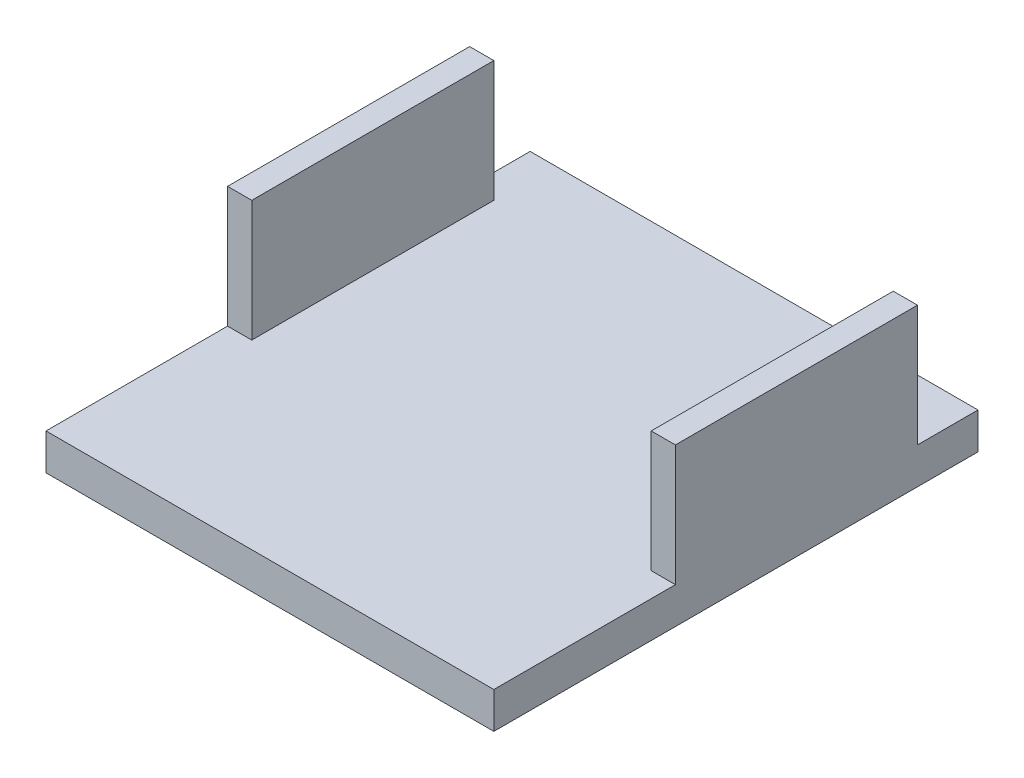
ISO-10303-21;
HEADER;
FILE_DESCRIPTION(('STEP AP214'),'2;1');
FILE_NAME('part.step','',(''),(''),'','','');
FILE_SCHEMA(('AUTOMOTIVE_DESIGN { 1 0 10303 214 1 1 1 1 }'));
ENDSEC;
DATA;
#1=APPLICATION_CONTEXT('core data for automotive mechanical design processes');
#2=APPLICATION_PROTOCOL_DEFINITION('international standard','automotive_design',2000,#1);
#3=PRODUCT_CONTEXT('',#1,'mechanical');
#4=PRODUCT('Part','Part','',(#3));
#5=PRODUCT_RELATED_PRODUCT_CATEGORY('part','',(#4));
#6=PRODUCT_DEFINITION_FORMATION('','',#4);
#7=PRODUCT_DEFINITION_CONTEXT('part definition',#1,'design');
#8=PRODUCT_DEFINITION('design','',#6,#7);
#9=PRODUCT_DEFINITION_SHAPE('','',#8);
#10=(LENGTH_UNIT() NAMED_UNIT(*) SI_UNIT(.MILLI.,.METRE.));
#11=(NAMED_UNIT(*) PLANE_ANGLE_UNIT() SI_UNIT($,.RADIAN.));
#12=(NAMED_UNIT(*) SI_UNIT($,.STERADIAN.) SOLID_ANGLE_UNIT());
#13=UNCERTAINTY_MEASURE_WITH_UNIT(LENGTH_MEASURE(1.E-05),#10,'distance_accuracy_value','');
#14=(GEOMETRIC_REPRESENTATION_CONTEXT(3) GLOBAL_UNCERTAINTY_ASSIGNED_CONTEXT((#13)) GLOBAL_UNIT_ASSIGNED_CONTEXT((#10,
#11,#12)) REPRESENTATION_CONTEXT('',''));
#15=CARTESIAN_POINT('',(0.,0.,0.));
#16=DIRECTION('',(0.,0.,1.));
#17=DIRECTION('',(1.,0.,0.));
#18=AXIS2_PLACEMENT_3D('',#15,#16,#17);
#19=CARTESIAN_POINT('',(0.,3.,0.));
#20=DIRECTION('',(0.,-1.,0.));
#21=DIRECTION('',(0.,0.,-1.));
#22=AXIS2_PLACEMENT_3D('',#19,#20,#21);
#23=PLANE('',#22);
#24=DIRECTION('',(1.,0.,0.));
#25=VECTOR('',#24,1.);
#26=CARTESIAN_POINT('',(0.,3.,-15.));
#27=LINE('',#26,#25);
#28=CARTESIAN_POINT('',(0.,3.,-15.));
#29=VERTEX_POINT('',#28);
#30=CARTESIAN_POINT('',(2.,3.,-15.));
#31=VERTEX_POINT('',#30);
#32=EDGE_CURVE('E227',#29,#31,#27,.T.);
#33=ORIENTED_EDGE('',*,*,#32,.F.);
#34=DIRECTION('',(0.,0.,1.));
#35=VECTOR('',#34,1.);
#36=CARTESIAN_POINT('',(0.,3.,0.));
#37=LINE('',#36,#35);
#38=CARTESIAN_POINT('',(0.,3.,0.));
#39=VERTEX_POINT('',#38);
#40=EDGE_CURVE('E145',#29,#39,#37,.T.);
#41=ORIENTED_EDGE('',*,*,#40,.T.);
#42=DIRECTION('',(1.,0.,0.));
#43=VECTOR('',#42,1.);
#44=CARTESIAN_POINT('',(0.,3.,0.));
#45=LINE('',#44,#43);
#46=CARTESIAN_POINT('',(37.,3.,0.));
#47=VERTEX_POINT('',#46);
#48=EDGE_CURVE('E184',#39,#47,#45,.T.);
#49=ORIENTED_EDGE('',*,*,#48,.T.);
#50=DIRECTION('',(0.,0.,-1.));
#51=VECTOR('',#50,1.);
#52=CARTESIAN_POINT('',(37.,3.,0.));
#53=LINE('',#52,#51);
#54=CARTESIAN_POINT('',(37.,3.,-15.));
#55=VERTEX_POINT('',#54);
#56=EDGE_CURVE('E187',#47,#55,#53,.T.);
#57=ORIENTED_EDGE('',*,*,#56,.T.);
#58=DIRECTION('',(1.,0.,0.));
#59=VECTOR('',#58,1.);
#60=CARTESIAN_POINT('',(37.,3.,-15.));
#61=LINE('',#60,#59);
#62=CARTESIAN_POINT('',(35.,3.,-15.));
#63=VERTEX_POINT('',#62);
#64=EDGE_CURVE('E159',#63,#55,#61,.T.);
#65=ORIENTED_EDGE('',*,*,#64,.F.);
#66=DIRECTION('',(0.,0.,1.));
#67=VECTOR('',#66,1.);
#68=CARTESIAN_POINT('',(35.,3.,-35.));
#69=LINE('',#68,#67);
#70=CARTESIAN_POINT('',(35.,3.,-35.));
#71=VERTEX_POINT('',#70);
#72=EDGE_CURVE('E149',#71,#63,#69,.T.);
#73=ORIENTED_EDGE('',*,*,#72,.F.);
#74=DIRECTION('',(-1.,0.,0.));
#75=VECTOR('',#74,1.);
#76=CARTESIAN_POINT('',(37.,3.,-35.));
#77=LINE('',#76,#75);
#78=CARTESIAN_POINT('',(37.,3.,-35.));
#79=VERTEX_POINT('',#78);
#80=EDGE_CURVE('E146',#79,#71,#77,.T.);
#81=ORIENTED_EDGE('',*,*,#80,.F.);
#82=CARTESIAN_POINT('',(37.,3.,-40.));
#83=VERTEX_POINT('',#82);
#84=EDGE_CURVE('E186',#79,#83,#53,.T.);
#85=ORIENTED_EDGE('',*,*,#84,.T.);
#86=DIRECTION('',(-1.,0.,0.));
#87=VECTOR('',#86,1.);
#88=CARTESIAN_POINT('',(0.,3.,-40.));
#89=LINE('',#88,#87);
#90=CARTESIAN_POINT('',(0.,3.,-40.));
#91=VERTEX_POINT('',#90);
#92=EDGE_CURVE('E189',#83,#91,#89,.T.);
#93=ORIENTED_EDGE('',*,*,#92,.T.);
#94=CARTESIAN_POINT('',(0.,3.,-35.));
#95=VERTEX_POINT('',#94);
#96=EDGE_CURVE('E182',#91,#95,#37,.T.);
#97=ORIENTED_EDGE('',*,*,#96,.T.);
#98=DIRECTION('',(-1.,0.,0.));
#99=VECTOR('',#98,1.);
#100=CARTESIAN_POINT('',(0.,3.,-35.));
#101=LINE('',#100,#99);
#102=CARTESIAN_POINT('',(2.,3.,-35.));
#103=VERTEX_POINT('',#102);
#104=EDGE_CURVE('E55',#103,#95,#101,.T.);
#105=ORIENTED_EDGE('',*,*,#104,.F.);
#106=DIRECTION('',(0.,0.,-1.));
#107=VECTOR('',#106,1.);
#108=CARTESIAN_POINT('',(2.,3.,-35.));
#109=LINE('',#108,#107);
#110=EDGE_CURVE('E50',#31,#103,#109,.T.);
#111=ORIENTED_EDGE('',*,*,#110,.F.);
#112=EDGE_LOOP('',(#33,#41,#49,#57,#65,#73,#81,#85,#93,#97,#105,#111));
#113=FACE_BOUND('',#112,.T.);
#114=ADVANCED_FACE('F35',(#113),#23,.F.);
#115=CARTESIAN_POINT('',(0.,3.,0.));
#116=DIRECTION('',(1.,0.,0.));
#117=DIRECTION('',(0.,0.,-1.));
#118=AXIS2_PLACEMENT_3D('',#115,#116,#117);
#119=PLANE('',#118);
#120=DIRECTION('',(0.,0.,1.));
#121=VECTOR('',#120,1.);
#122=CARTESIAN_POINT('',(0.,0.,0.));
#123=LINE('',#122,#121);
#124=CARTESIAN_POINT('',(0.,0.,-40.));
#125=VERTEX_POINT('',#124);
#126=CARTESIAN_POINT('',(0.,0.,0.));
#127=VERTEX_POINT('',#126);
#128=EDGE_CURVE('E181',#125,#127,#123,.T.);
#129=ORIENTED_EDGE('',*,*,#128,.T.);
#130=DIRECTION('',(0.,-1.,0.));
#131=VECTOR('',#130,1.);
#132=CARTESIAN_POINT('',(0.,3.,0.));
#133=LINE('',#132,#131);
#134=EDGE_CURVE('E11',#39,#127,#133,.T.);
#135=ORIENTED_EDGE('',*,*,#134,.F.);
#136=ORIENTED_EDGE('',*,*,#40,.F.);
#137=DIRECTION('',(0.,-1.,0.));
#138=VECTOR('',#137,1.);
#139=CARTESIAN_POINT('',(0.,13.,-15.));
#140=LINE('',#139,#138);
#141=CARTESIAN_POINT('',(0.,13.,-15.));
#142=VERTEX_POINT('',#141);
#143=EDGE_CURVE('E127',#142,#29,#140,.T.);
#144=ORIENTED_EDGE('',*,*,#143,.F.);
#145=DIRECTION('',(0.,0.,1.));
#146=VECTOR('',#145,1.);
#147=CARTESIAN_POINT('',(0.,13.,-35.));
#148=LINE('',#147,#146);
#149=CARTESIAN_POINT('',(0.,13.,-35.));
#150=VERTEX_POINT('',#149);
#151=EDGE_CURVE('E133',#150,#142,#148,.T.);
#152=ORIENTED_EDGE('',*,*,#151,.F.);
#153=DIRECTION('',(0.,-1.,0.));
#154=VECTOR('',#153,1.);
#155=CARTESIAN_POINT('',(0.,13.,-35.));
#156=LINE('',#155,#154);
#157=EDGE_CURVE('E221',#150,#95,#156,.T.);
#158=ORIENTED_EDGE('',*,*,#157,.T.);
#159=ORIENTED_EDGE('',*,*,#96,.F.);
#160=DIRECTION('',(0.,-1.,0.));
#161=VECTOR('',#160,1.);
#162=CARTESIAN_POINT('',(0.,3.,-40.));
#163=LINE('',#162,#161);
#164=EDGE_CURVE('E191',#91,#125,#163,.T.);
#165=ORIENTED_EDGE('',*,*,#164,.T.);
#166=EDGE_LOOP('',(#129,#135,#136,#144,#152,#158,#159,#165));
#167=FACE_BOUND('',#166,.T.);
#168=ADVANCED_FACE('F37',(#167),#119,.F.);
#169=CARTESIAN_POINT('',(0.,3.,0.));
#170=DIRECTION('',(0.,0.,-1.));
#171=DIRECTION('',(-1.,0.,0.));
#172=AXIS2_PLACEMENT_3D('',#169,#170,#171);
#173=PLANE('',#172);
#174=DIRECTION('',(1.,0.,0.));
#175=VECTOR('',#174,1.);
#176=CARTESIAN_POINT('',(0.,0.,0.));
#177=LINE('',#176,#175);
#178=CARTESIAN_POINT('',(37.,0.,0.));
#179=VERTEX_POINT('',#178);
#180=EDGE_CURVE('E193',#127,#179,#177,.T.);
#181=ORIENTED_EDGE('',*,*,#180,.T.);
#182=DIRECTION('',(0.,-1.,0.));
#183=VECTOR('',#182,1.);
#184=CARTESIAN_POINT('',(37.,3.,0.));
#185=LINE('',#184,#183);
#186=EDGE_CURVE('E43',#47,#179,#185,.T.);
#187=ORIENTED_EDGE('',*,*,#186,.F.);
#188=ORIENTED_EDGE('',*,*,#48,.F.);
#189=ORIENTED_EDGE('',*,*,#134,.T.);
#190=EDGE_LOOP('',(#181,#187,#188,#189));
#191=FACE_BOUND('',#190,.T.);
#192=ADVANCED_FACE('F249',(#191),#173,.F.);
#193=CARTESIAN_POINT('',(37.,3.,0.));
#194=DIRECTION('',(-1.,0.,0.));
#195=DIRECTION('',(0.,0.,1.));
#196=AXIS2_PLACEMENT_3D('',#193,#194,#195);
#197=PLANE('',#196);
#198=DIRECTION('',(0.,0.,-1.));
#199=VECTOR('',#198,1.);
#200=CARTESIAN_POINT('',(37.,0.,0.));
#201=LINE('',#200,#199);
#202=CARTESIAN_POINT('',(37.,0.,-40.));
#203=VERTEX_POINT('',#202);
#204=EDGE_CURVE('E195',#179,#203,#201,.T.);
#205=ORIENTED_EDGE('',*,*,#204,.T.);
#206=DIRECTION('',(0.,-1.,0.));
#207=VECTOR('',#206,1.);
#208=CARTESIAN_POINT('',(37.,3.,-40.));
#209=LINE('',#208,#207);
#210=EDGE_CURVE('E201',#83,#203,#209,.T.);
#211=ORIENTED_EDGE('',*,*,#210,.F.);
#212=ORIENTED_EDGE('',*,*,#84,.F.);
#213=DIRECTION('',(0.,-1.,0.));
#214=VECTOR('',#213,1.);
#215=CARTESIAN_POINT('',(37.,13.,-35.));
#216=LINE('',#215,#214);
#217=CARTESIAN_POINT('',(37.,13.,-35.));
#218=VERTEX_POINT('',#217);
#219=EDGE_CURVE('E178',#218,#79,#216,.T.);
#220=ORIENTED_EDGE('',*,*,#219,.F.);
#221=DIRECTION('',(0.,0.,-1.));
#222=VECTOR('',#221,1.);
#223=CARTESIAN_POINT('',(37.,13.,-35.));
#224=LINE('',#223,#222);
#225=CARTESIAN_POINT('',(37.,13.,-15.));
#226=VERTEX_POINT('',#225);
#227=EDGE_CURVE('E155',#226,#218,#224,.T.);
#228=ORIENTED_EDGE('',*,*,#227,.F.);
#229=DIRECTION('',(0.,-1.,0.));
#230=VECTOR('',#229,1.);
#231=CARTESIAN_POINT('',(37.,13.,-15.));
#232=LINE('',#231,#230);
#233=EDGE_CURVE('E164',#226,#55,#232,.T.);
#234=ORIENTED_EDGE('',*,*,#233,.T.);
#235=ORIENTED_EDGE('',*,*,#56,.F.);
#236=ORIENTED_EDGE('',*,*,#186,.T.);
#237=EDGE_LOOP('',(#205,#211,#212,#220,#228,#234,#235,#236));
#238=FACE_BOUND('',#237,.T.);
#239=ADVANCED_FACE('F208',(#238),#197,.F.);
#240=CARTESIAN_POINT('',(0.,3.,-40.));
#241=DIRECTION('',(0.,0.,1.));
#242=DIRECTION('',(1.,0.,0.));
#243=AXIS2_PLACEMENT_3D('',#240,#241,#242);
#244=PLANE('',#243);
#245=DIRECTION('',(-1.,0.,0.));
#246=VECTOR('',#245,1.);
#247=CARTESIAN_POINT('',(0.,0.,-40.));
#248=LINE('',#247,#246);
#249=EDGE_CURVE('E197',#203,#125,#248,.T.);
#250=ORIENTED_EDGE('',*,*,#249,.T.);
#251=ORIENTED_EDGE('',*,*,#164,.F.);
#252=ORIENTED_EDGE('',*,*,#92,.F.);
#253=ORIENTED_EDGE('',*,*,#210,.T.);
#254=EDGE_LOOP('',(#250,#251,#252,#253));
#255=FACE_BOUND('',#254,.T.);
#256=ADVANCED_FACE('F218',(#255),#244,.F.);
#257=CARTESIAN_POINT('',(0.,0.,0.));
#258=DIRECTION('',(0.,-1.,0.));
#259=DIRECTION('',(0.,0.,-1.));
#260=AXIS2_PLACEMENT_3D('',#257,#258,#259);
#261=PLANE('',#260);
#262=ORIENTED_EDGE('',*,*,#128,.F.);
#263=ORIENTED_EDGE('',*,*,#249,.F.);
#264=ORIENTED_EDGE('',*,*,#204,.F.);
#265=ORIENTED_EDGE('',*,*,#180,.F.);
#266=EDGE_LOOP('',(#262,#263,#264,#265));
#267=FACE_BOUND('',#266,.T.);
#268=ADVANCED_FACE('F215',(#267),#261,.T.);
#269=CARTESIAN_POINT('',(37.,13.,-35.));
#270=DIRECTION('',(0.,0.,1.));
#271=DIRECTION('',(1.,0.,0.));
#272=AXIS2_PLACEMENT_3D('',#269,#270,#271);
#273=PLANE('',#272);
#274=ORIENTED_EDGE('',*,*,#80,.T.);
#275=DIRECTION('',(0.,-1.,0.));
#276=VECTOR('',#275,1.);
#277=CARTESIAN_POINT('',(35.,13.,-35.));
#278=LINE('',#277,#276);
#279=CARTESIAN_POINT('',(35.,13.,-35.));
#280=VERTEX_POINT('',#279);
#281=EDGE_CURVE('E175',#280,#71,#278,.T.);
#282=ORIENTED_EDGE('',*,*,#281,.F.);
#283=DIRECTION('',(-1.,0.,0.));
#284=VECTOR('',#283,1.);
#285=CARTESIAN_POINT('',(37.,13.,-35.));
#286=LINE('',#285,#284);
#287=EDGE_CURVE('E158',#218,#280,#286,.T.);
#288=ORIENTED_EDGE('',*,*,#287,.F.);
#289=ORIENTED_EDGE('',*,*,#219,.T.);
#290=EDGE_LOOP('',(#274,#282,#288,#289));
#291=FACE_BOUND('',#290,.T.);
#292=ADVANCED_FACE('F252',(#291),#273,.F.);
#293=CARTESIAN_POINT('',(35.,13.,-35.));
#294=DIRECTION('',(1.,0.,0.));
#295=DIRECTION('',(0.,0.,-1.));
#296=AXIS2_PLACEMENT_3D('',#293,#294,#295);
#297=PLANE('',#296);
#298=ORIENTED_EDGE('',*,*,#72,.T.);
#299=DIRECTION('',(0.,-1.,0.));
#300=VECTOR('',#299,1.);
#301=CARTESIAN_POINT('',(35.,13.,-15.));
#302=LINE('',#301,#300);
#303=CARTESIAN_POINT('',(35.,13.,-15.));
#304=VERTEX_POINT('',#303);
#305=EDGE_CURVE('E172',#304,#63,#302,.T.);
#306=ORIENTED_EDGE('',*,*,#305,.F.);
#307=DIRECTION('',(0.,0.,1.));
#308=VECTOR('',#307,1.);
#309=CARTESIAN_POINT('',(35.,13.,-35.));
#310=LINE('',#309,#308);
#311=EDGE_CURVE('E161',#280,#304,#310,.T.);
#312=ORIENTED_EDGE('',*,*,#311,.F.);
#313=ORIENTED_EDGE('',*,*,#281,.T.);
#314=EDGE_LOOP('',(#298,#306,#312,#313));
#315=FACE_BOUND('',#314,.T.);
#316=ADVANCED_FACE('F274',(#315),#297,.F.);
#317=CARTESIAN_POINT('',(37.,13.,-15.));
#318=DIRECTION('',(0.,0.,-1.));
#319=DIRECTION('',(-1.,0.,0.));
#320=AXIS2_PLACEMENT_3D('',#317,#318,#319);
#321=PLANE('',#320);
#322=ORIENTED_EDGE('',*,*,#64,.T.);
#323=ORIENTED_EDGE('',*,*,#233,.F.);
#324=DIRECTION('',(1.,0.,0.));
#325=VECTOR('',#324,1.);
#326=CARTESIAN_POINT('',(37.,13.,-15.));
#327=LINE('',#326,#325);
#328=EDGE_CURVE('E163',#304,#226,#327,.T.);
#329=ORIENTED_EDGE('',*,*,#328,.F.);
#330=ORIENTED_EDGE('',*,*,#305,.T.);
#331=EDGE_LOOP('',(#322,#323,#329,#330));
#332=FACE_BOUND('',#331,.T.);
#333=ADVANCED_FACE('F264',(#332),#321,.F.);
#334=CARTESIAN_POINT('',(0.,13.,0.));
#335=DIRECTION('',(0.,-1.,0.));
#336=DIRECTION('',(0.,0.,-1.));
#337=AXIS2_PLACEMENT_3D('',#334,#335,#336);
#338=PLANE('',#337);
#339=ORIENTED_EDGE('',*,*,#227,.T.);
#340=ORIENTED_EDGE('',*,*,#287,.T.);
#341=ORIENTED_EDGE('',*,*,#311,.T.);
#342=ORIENTED_EDGE('',*,*,#328,.T.);
#343=EDGE_LOOP('',(#339,#340,#341,#342));
#344=FACE_BOUND('',#343,.T.);
#345=ADVANCED_FACE('F242',(#344),#338,.F.);
#346=CARTESIAN_POINT('',(0.,13.,-15.));
#347=DIRECTION('',(0.,0.,-1.));
#348=DIRECTION('',(-1.,0.,0.));
#349=AXIS2_PLACEMENT_3D('',#346,#347,#348);
#350=PLANE('',#349);
#351=ORIENTED_EDGE('',*,*,#32,.T.);
#352=DIRECTION('',(0.,-1.,0.));
#353=VECTOR('',#352,1.);
#354=CARTESIAN_POINT('',(2.,13.,-15.));
#355=LINE('',#354,#353);
#356=CARTESIAN_POINT('',(2.,13.,-15.));
#357=VERTEX_POINT('',#356);
#358=EDGE_CURVE('E129',#357,#31,#355,.T.);
#359=ORIENTED_EDGE('',*,*,#358,.F.);
#360=DIRECTION('',(1.,0.,0.));
#361=VECTOR('',#360,1.);
#362=CARTESIAN_POINT('',(0.,13.,-15.));
#363=LINE('',#362,#361);
#364=EDGE_CURVE('E123',#142,#357,#363,.T.);
#365=ORIENTED_EDGE('',*,*,#364,.F.);
#366=ORIENTED_EDGE('',*,*,#143,.T.);
#367=EDGE_LOOP('',(#351,#359,#365,#366));
#368=FACE_BOUND('',#367,.T.);
#369=ADVANCED_FACE('F125',(#368),#350,.F.);
#370=CARTESIAN_POINT('',(2.,13.,-35.));
#371=DIRECTION('',(-1.,0.,0.));
#372=DIRECTION('',(0.,0.,1.));
#373=AXIS2_PLACEMENT_3D('',#370,#371,#372);
#374=PLANE('',#373);
#375=ORIENTED_EDGE('',*,*,#110,.T.);
#376=DIRECTION('',(0.,-1.,0.));
#377=VECTOR('',#376,1.);
#378=CARTESIAN_POINT('',(2.,13.,-35.));
#379=LINE('',#378,#377);
#380=CARTESIAN_POINT('',(2.,13.,-35.));
#381=VERTEX_POINT('',#380);
#382=EDGE_CURVE('E151',#381,#103,#379,.T.);
#383=ORIENTED_EDGE('',*,*,#382,.F.);
#384=DIRECTION('',(0.,0.,-1.));
#385=VECTOR('',#384,1.);
#386=CARTESIAN_POINT('',(2.,13.,-35.));
#387=LINE('',#386,#385);
#388=EDGE_CURVE('E132',#357,#381,#387,.T.);
#389=ORIENTED_EDGE('',*,*,#388,.F.);
#390=ORIENTED_EDGE('',*,*,#358,.T.);
#391=EDGE_LOOP('',(#375,#383,#389,#390));
#392=FACE_BOUND('',#391,.T.);
#393=ADVANCED_FACE('F234',(#392),#374,.F.);
#394=CARTESIAN_POINT('',(0.,13.,-35.));
#395=DIRECTION('',(0.,0.,1.));
#396=DIRECTION('',(1.,0.,0.));
#397=AXIS2_PLACEMENT_3D('',#394,#395,#396);
#398=PLANE('',#397);
#399=ORIENTED_EDGE('',*,*,#104,.T.);
#400=ORIENTED_EDGE('',*,*,#157,.F.);
#401=DIRECTION('',(-1.,0.,0.));
#402=VECTOR('',#401,1.);
#403=CARTESIAN_POINT('',(0.,13.,-35.));
#404=LINE('',#403,#402);
#405=EDGE_CURVE('E138',#381,#150,#404,.T.);
#406=ORIENTED_EDGE('',*,*,#405,.F.);
#407=ORIENTED_EDGE('',*,*,#382,.T.);
#408=EDGE_LOOP('',(#399,#400,#406,#407));
#409=FACE_BOUND('',#408,.T.);
#410=ADVANCED_FACE('F224',(#409),#398,.F.);
#411=CARTESIAN_POINT('',(0.,13.,0.));
#412=DIRECTION('',(0.,1.,0.));
#413=DIRECTION('',(0.,0.,1.));
#414=AXIS2_PLACEMENT_3D('',#411,#412,#413);
#415=PLANE('',#414);
#416=ORIENTED_EDGE('',*,*,#151,.T.);
#417=ORIENTED_EDGE('',*,*,#364,.T.);
#418=ORIENTED_EDGE('',*,*,#388,.T.);
#419=ORIENTED_EDGE('',*,*,#405,.T.);
#420=EDGE_LOOP('',(#416,#417,#418,#419));
#421=FACE_BOUND('',#420,.T.);
#422=ADVANCED_FACE('F136',(#421),#415,.T.);
#423=CLOSED_SHELL('',(#114,#168,#192,#239,#256,#268,#292,#316,#333,#345,#369,#393,#410,#422));
#424=MANIFOLD_SOLID_BREP('B2',#423);
#425=ADVANCED_BREP_SHAPE_REPRESENTATION('',(#18,#424),#14);
#426=SHAPE_DEFINITION_REPRESENTATION(#9,#425);
ENDSEC;
END-ISO-10303-21;
